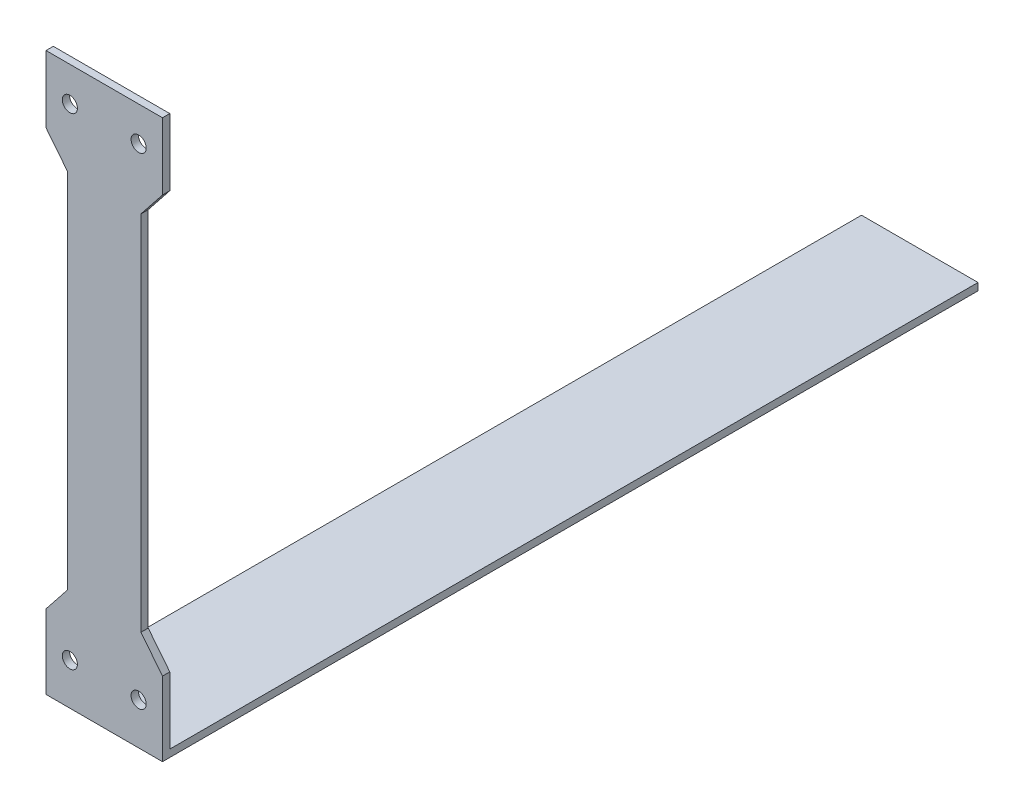
ISO-10303-21;
HEADER;
FILE_DESCRIPTION(('STEP AP214'),'2;1');
FILE_NAME('part.step','',(''),(''),'','','');
FILE_SCHEMA(('AUTOMOTIVE_DESIGN { 1 0 10303 214 1 1 1 1 }'));
ENDSEC;
DATA;
#1=APPLICATION_CONTEXT('core data for automotive mechanical design processes');
#2=APPLICATION_PROTOCOL_DEFINITION('international standard','automotive_design',2000,#1);
#3=PRODUCT_CONTEXT('',#1,'mechanical');
#4=PRODUCT('Part','Part','',(#3));
#5=PRODUCT_RELATED_PRODUCT_CATEGORY('part','',(#4));
#6=PRODUCT_DEFINITION_FORMATION('','',#4);
#7=PRODUCT_DEFINITION_CONTEXT('part definition',#1,'design');
#8=PRODUCT_DEFINITION('design','',#6,#7);
#9=PRODUCT_DEFINITION_SHAPE('','',#8);
#10=(LENGTH_UNIT() NAMED_UNIT(*) SI_UNIT(.MILLI.,.METRE.));
#11=(NAMED_UNIT(*) PLANE_ANGLE_UNIT() SI_UNIT($,.RADIAN.));
#12=(NAMED_UNIT(*) SI_UNIT($,.STERADIAN.) SOLID_ANGLE_UNIT());
#13=UNCERTAINTY_MEASURE_WITH_UNIT(LENGTH_MEASURE(1.E-05),#10,'distance_accuracy_value','');
#14=(GEOMETRIC_REPRESENTATION_CONTEXT(3) GLOBAL_UNCERTAINTY_ASSIGNED_CONTEXT((#13)) GLOBAL_UNIT_ASSIGNED_CONTEXT((#10,
#11,#12)) REPRESENTATION_CONTEXT('',''));
#15=CARTESIAN_POINT('',(0.,0.,0.));
#16=DIRECTION('',(0.,0.,1.));
#17=DIRECTION('',(1.,0.,0.));
#18=AXIS2_PLACEMENT_3D('',#15,#16,#17);
#19=CARTESIAN_POINT('',(-112.3,0.,1.5875));
#20=DIRECTION('',(1.,0.,0.));
#21=DIRECTION('',(0.,0.,-1.));
#22=AXIS2_PLACEMENT_3D('',#19,#20,#21);
#23=PLANE('',#22);
#24=DIRECTION('',(0.,-1.,0.));
#25=VECTOR('',#24,1.);
#26=CARTESIAN_POINT('',(-112.3,0.,0.));
#27=LINE('',#26,#25);
#28=CARTESIAN_POINT('',(-112.3,120.,0.));
#29=VERTEX_POINT('',#28);
#30=CARTESIAN_POINT('',(-112.3,105.418518518518,0.));
#31=VERTEX_POINT('',#30);
#32=EDGE_CURVE('E181',#29,#31,#27,.T.);
#33=ORIENTED_EDGE('',*,*,#32,.F.);
#34=DIRECTION('',(0.,0.,-1.));
#35=VECTOR('',#34,1.);
#36=CARTESIAN_POINT('',(-112.3,120.,1.5875));
#37=LINE('',#36,#35);
#38=CARTESIAN_POINT('',(-112.3,120.,1.5875));
#39=VERTEX_POINT('',#38);
#40=EDGE_CURVE('E11',#39,#29,#37,.T.);
#41=ORIENTED_EDGE('',*,*,#40,.F.);
#42=DIRECTION('',(0.,-1.,0.));
#43=VECTOR('',#42,1.);
#44=CARTESIAN_POINT('',(-112.3,0.,1.5875));
#45=LINE('',#44,#43);
#46=CARTESIAN_POINT('',(-112.3,105.418518518518,1.5875));
#47=VERTEX_POINT('',#46);
#48=EDGE_CURVE('E489',#39,#47,#45,.T.);
#49=ORIENTED_EDGE('',*,*,#48,.T.);
#50=DIRECTION('',(0.,0.,-1.));
#51=VECTOR('',#50,1.);
#52=CARTESIAN_POINT('',(-112.3,105.418518518518,1.5875));
#53=LINE('',#52,#51);
#54=EDGE_CURVE('E102',#47,#31,#53,.T.);
#55=ORIENTED_EDGE('',*,*,#54,.T.);
#56=EDGE_LOOP('',(#33,#41,#49,#55));
#57=FACE_BOUND('',#56,.T.);
#58=ADVANCED_FACE('F41',(#57),#23,.T.);
#59=CARTESIAN_POINT('',(0.,120.,1.5875));
#60=DIRECTION('',(0.,1.,0.));
#61=DIRECTION('',(0.,0.,1.));
#62=AXIS2_PLACEMENT_3D('',#59,#60,#61);
#63=PLANE('',#62);
#64=DIRECTION('',(1.,0.,0.));
#65=VECTOR('',#64,1.);
#66=CARTESIAN_POINT('',(0.,120.,0.));
#67=LINE('',#66,#65);
#68=CARTESIAN_POINT('',(-137.7,120.,0.));
#69=VERTEX_POINT('',#68);
#70=EDGE_CURVE('E179',#69,#29,#67,.T.);
#71=ORIENTED_EDGE('',*,*,#70,.F.);
#72=DIRECTION('',(0.,0.,-1.));
#73=VECTOR('',#72,1.);
#74=CARTESIAN_POINT('',(-137.7,120.,1.5875));
#75=LINE('',#74,#73);
#76=CARTESIAN_POINT('',(-137.7,120.,1.5875));
#77=VERTEX_POINT('',#76);
#78=EDGE_CURVE('E50',#77,#69,#75,.T.);
#79=ORIENTED_EDGE('',*,*,#78,.F.);
#80=DIRECTION('',(1.,0.,0.));
#81=VECTOR('',#80,1.);
#82=CARTESIAN_POINT('',(0.,120.,1.5875));
#83=LINE('',#82,#81);
#84=EDGE_CURVE('E491',#77,#39,#83,.T.);
#85=ORIENTED_EDGE('',*,*,#84,.T.);
#86=ORIENTED_EDGE('',*,*,#40,.T.);
#87=EDGE_LOOP('',(#71,#79,#85,#86));
#88=FACE_BOUND('',#87,.T.);
#89=ADVANCED_FACE('F180',(#88),#63,.T.);
#90=CARTESIAN_POINT('',(-137.7,0.,1.5875));
#91=DIRECTION('',(-1.,0.,0.));
#92=DIRECTION('',(0.,0.,1.));
#93=AXIS2_PLACEMENT_3D('',#90,#91,#92);
#94=PLANE('',#93);
#95=DIRECTION('',(0.,1.,0.));
#96=VECTOR('',#95,1.);
#97=CARTESIAN_POINT('',(-137.7,0.,0.));
#98=LINE('',#97,#96);
#99=CARTESIAN_POINT('',(-137.7,105.418518518518,0.));
#100=VERTEX_POINT('',#99);
#101=EDGE_CURVE('E172',#100,#69,#98,.T.);
#102=ORIENTED_EDGE('',*,*,#101,.F.);
#103=DIRECTION('',(0.,0.,-1.));
#104=VECTOR('',#103,1.);
#105=CARTESIAN_POINT('',(-137.7,105.418518518518,1.5875));
#106=LINE('',#105,#104);
#107=CARTESIAN_POINT('',(-137.7,105.418518518518,1.5875));
#108=VERTEX_POINT('',#107);
#109=EDGE_CURVE('E165',#108,#100,#106,.T.);
#110=ORIENTED_EDGE('',*,*,#109,.F.);
#111=DIRECTION('',(0.,1.,0.));
#112=VECTOR('',#111,1.);
#113=CARTESIAN_POINT('',(-137.7,0.,1.5875));
#114=LINE('',#113,#112);
#115=EDGE_CURVE('E174',#108,#77,#114,.T.);
#116=ORIENTED_EDGE('',*,*,#115,.T.);
#117=ORIENTED_EDGE('',*,*,#78,.T.);
#118=EDGE_LOOP('',(#102,#110,#116,#117));
#119=FACE_BOUND('',#118,.T.);
#120=ADVANCED_FACE('F170',(#119),#94,.T.);
#121=CARTESIAN_POINT('',(-33.1071618037136,-26.2909814323608,1.5875));
#122=DIRECTION('',(0.783110847498294,0.621882143601586,0.));
#123=DIRECTION('',(-0.621882143601586,0.783110847498294,0.));
#124=AXIS2_PLACEMENT_3D('',#121,#122,#123);
#125=PLANE('',#124);
#126=DIRECTION('',(0.621882143601586,-0.783110847498294,0.));
#127=VECTOR('',#126,1.);
#128=CARTESIAN_POINT('',(-33.1071618037136,-26.2909814323608,0.));
#129=LINE('',#128,#127);
#130=CARTESIAN_POINT('',(-133.,99.5,0.));
#131=VERTEX_POINT('',#130);
#132=EDGE_CURVE('E186',#100,#131,#129,.T.);
#133=ORIENTED_EDGE('',*,*,#132,.T.);
#134=DIRECTION('',(0.,0.,-1.));
#135=VECTOR('',#134,1.);
#136=CARTESIAN_POINT('',(-133.,99.5,1.5875));
#137=LINE('',#136,#135);
#138=CARTESIAN_POINT('',(-133.,99.5,1.5875));
#139=VERTEX_POINT('',#138);
#140=EDGE_CURVE('E162',#139,#131,#137,.T.);
#141=ORIENTED_EDGE('',*,*,#140,.F.);
#142=DIRECTION('',(0.621882143601586,-0.783110847498294,0.));
#143=VECTOR('',#142,1.);
#144=CARTESIAN_POINT('',(-33.1071618037136,-26.2909814323608,1.5875));
#145=LINE('',#144,#143);
#146=EDGE_CURVE('E494',#108,#139,#145,.T.);
#147=ORIENTED_EDGE('',*,*,#146,.F.);
#148=ORIENTED_EDGE('',*,*,#109,.T.);
#149=EDGE_LOOP('',(#133,#141,#147,#148));
#150=FACE_BOUND('',#149,.T.);
#151=ADVANCED_FACE('F296',(#150),#125,.F.);
#152=CARTESIAN_POINT('',(-133.,0.,1.5875));
#153=DIRECTION('',(1.,0.,0.));
#154=DIRECTION('',(0.,0.,-1.));
#155=AXIS2_PLACEMENT_3D('',#152,#153,#154);
#156=PLANE('',#155);
#157=DIRECTION('',(0.,-1.,0.));
#158=VECTOR('',#157,1.);
#159=CARTESIAN_POINT('',(-133.,0.,0.));
#160=LINE('',#159,#158);
#161=CARTESIAN_POINT('',(-133.,20.5,0.));
#162=VERTEX_POINT('',#161);
#163=EDGE_CURVE('E188',#131,#162,#160,.T.);
#164=ORIENTED_EDGE('',*,*,#163,.T.);
#165=DIRECTION('',(0.,0.,-1.));
#166=VECTOR('',#165,1.);
#167=CARTESIAN_POINT('',(-133.,20.5,1.5875));
#168=LINE('',#167,#166);
#169=CARTESIAN_POINT('',(-133.,20.5,1.5875));
#170=VERTEX_POINT('',#169);
#171=EDGE_CURVE('E159',#170,#162,#168,.T.);
#172=ORIENTED_EDGE('',*,*,#171,.F.);
#173=DIRECTION('',(0.,-1.,0.));
#174=VECTOR('',#173,1.);
#175=CARTESIAN_POINT('',(-133.,0.,1.5875));
#176=LINE('',#175,#174);
#177=EDGE_CURVE('E497',#139,#170,#176,.T.);
#178=ORIENTED_EDGE('',*,*,#177,.F.);
#179=ORIENTED_EDGE('',*,*,#140,.T.);
#180=EDGE_LOOP('',(#164,#172,#178,#179));
#181=FACE_BOUND('',#180,.T.);
#182=ADVANCED_FACE('F292',(#181),#156,.F.);
#183=CARTESIAN_POINT('',(-91.5474801061009,72.6994694960212,1.5875));
#184=DIRECTION('',(0.783110847498294,-0.621882143601586,0.));
#185=DIRECTION('',(0.621882143601586,0.783110847498294,0.));
#186=AXIS2_PLACEMENT_3D('',#183,#184,#185);
#187=PLANE('',#186);
#188=DIRECTION('',(-0.621882143601586,-0.783110847498294,0.));
#189=VECTOR('',#188,1.);
#190=CARTESIAN_POINT('',(-91.5474801061009,72.6994694960212,0.));
#191=LINE('',#190,#189);
#192=CARTESIAN_POINT('',(-137.7,14.5814814814815,0.));
#193=VERTEX_POINT('',#192);
#194=EDGE_CURVE('E194',#162,#193,#191,.T.);
#195=ORIENTED_EDGE('',*,*,#194,.T.);
#196=DIRECTION('',(0.,0.,-1.));
#197=VECTOR('',#196,1.);
#198=CARTESIAN_POINT('',(-137.7,14.5814814814815,1.5875));
#199=LINE('',#198,#197);
#200=CARTESIAN_POINT('',(-137.7,14.5814814814815,1.5875));
#201=VERTEX_POINT('',#200);
#202=EDGE_CURVE('E152',#201,#193,#199,.T.);
#203=ORIENTED_EDGE('',*,*,#202,.F.);
#204=DIRECTION('',(-0.621882143601586,-0.783110847498294,0.));
#205=VECTOR('',#204,1.);
#206=CARTESIAN_POINT('',(-91.5474801061009,72.6994694960212,1.5875));
#207=LINE('',#206,#205);
#208=EDGE_CURVE('E500',#170,#201,#207,.T.);
#209=ORIENTED_EDGE('',*,*,#208,.F.);
#210=ORIENTED_EDGE('',*,*,#171,.T.);
#211=EDGE_LOOP('',(#195,#203,#209,#210));
#212=FACE_BOUND('',#211,.T.);
#213=ADVANCED_FACE('F288',(#212),#187,.F.);
#214=CARTESIAN_POINT('',(-137.7,0.,1.5875));
#215=DIRECTION('',(1.,0.,0.));
#216=DIRECTION('',(0.,0.,-1.));
#217=AXIS2_PLACEMENT_3D('',#214,#215,#216);
#218=PLANE('',#217);
#219=DIRECTION('',(0.,-1.,0.));
#220=VECTOR('',#219,1.);
#221=CARTESIAN_POINT('',(-137.7,0.,0.));
#222=LINE('',#221,#220);
#223=CARTESIAN_POINT('',(-137.7,0.,0.));
#224=VERTEX_POINT('',#223);
#225=EDGE_CURVE('E197',#193,#224,#222,.T.);
#226=ORIENTED_EDGE('',*,*,#225,.T.);
#227=DIRECTION('',(0.,0.,1.));
#228=VECTOR('',#227,1.);
#229=CARTESIAN_POINT('',(-137.7,0.,-176.2125));
#230=LINE('',#229,#228);
#231=CARTESIAN_POINT('',(-137.7,0.,-176.2125));
#232=VERTEX_POINT('',#231);
#233=EDGE_CURVE('E456',#232,#224,#230,.T.);
#234=ORIENTED_EDGE('',*,*,#233,.F.);
#235=DIRECTION('',(0.,1.,0.));
#236=VECTOR('',#235,1.);
#237=CARTESIAN_POINT('',(-137.7,-1.5875,-176.2125));
#238=LINE('',#237,#236);
#239=CARTESIAN_POINT('',(-137.7,-1.5875,-176.2125));
#240=VERTEX_POINT('',#239);
#241=EDGE_CURVE('E216',#240,#232,#238,.T.);
#242=ORIENTED_EDGE('',*,*,#241,.F.);
#243=DIRECTION('',(0.,0.,1.));
#244=VECTOR('',#243,1.);
#245=CARTESIAN_POINT('',(-137.7,-1.5875,-176.2125));
#246=LINE('',#245,#244);
#247=CARTESIAN_POINT('',(-137.7,-1.5875,1.5875));
#248=VERTEX_POINT('',#247);
#249=EDGE_CURVE('E450',#240,#248,#246,.T.);
#250=ORIENTED_EDGE('',*,*,#249,.T.);
#251=DIRECTION('',(0.,-1.,0.));
#252=VECTOR('',#251,1.);
#253=CARTESIAN_POINT('',(-137.7,0.,1.5875));
#254=LINE('',#253,#252);
#255=EDGE_CURVE('E459',#201,#248,#254,.T.);
#256=ORIENTED_EDGE('',*,*,#255,.F.);
#257=ORIENTED_EDGE('',*,*,#202,.T.);
#258=EDGE_LOOP('',(#226,#234,#242,#250,#256,#257));
#259=FACE_BOUND('',#258,.T.);
#260=ADVANCED_FACE('F284',(#259),#218,.F.);
#261=CARTESIAN_POINT('',(-112.3,0.,1.5875));
#262=DIRECTION('',(1.,0.,0.));
#263=DIRECTION('',(0.,0.,-1.));
#264=AXIS2_PLACEMENT_3D('',#261,#262,#263);
#265=PLANE('',#264);
#266=DIRECTION('',(0.,-1.,0.));
#267=VECTOR('',#266,1.);
#268=CARTESIAN_POINT('',(-112.3,0.,0.));
#269=LINE('',#268,#267);
#270=CARTESIAN_POINT('',(-112.3,14.5814814814814,0.));
#271=VERTEX_POINT('',#270);
#272=CARTESIAN_POINT('',(-112.3,0.,0.));
#273=VERTEX_POINT('',#272);
#274=EDGE_CURVE('E203',#271,#273,#269,.T.);
#275=ORIENTED_EDGE('',*,*,#274,.F.);
#276=DIRECTION('',(0.,0.,-1.));
#277=VECTOR('',#276,1.);
#278=CARTESIAN_POINT('',(-112.3,14.5814814814814,1.5875));
#279=LINE('',#278,#277);
#280=CARTESIAN_POINT('',(-112.3,14.5814814814814,1.5875));
#281=VERTEX_POINT('',#280);
#282=EDGE_CURVE('E150',#281,#271,#279,.T.);
#283=ORIENTED_EDGE('',*,*,#282,.F.);
#284=DIRECTION('',(0.,-1.,0.));
#285=VECTOR('',#284,1.);
#286=CARTESIAN_POINT('',(-112.3,0.,1.5875));
#287=LINE('',#286,#285);
#288=CARTESIAN_POINT('',(-112.3,-1.5875,1.5875));
#289=VERTEX_POINT('',#288);
#290=EDGE_CURVE('E144',#281,#289,#287,.T.);
#291=ORIENTED_EDGE('',*,*,#290,.T.);
#292=DIRECTION('',(0.,0.,-1.));
#293=VECTOR('',#292,1.);
#294=CARTESIAN_POINT('',(-112.3,-1.5875,1.5875));
#295=LINE('',#294,#293);
#296=CARTESIAN_POINT('',(-112.3,-1.5875,-176.2125));
#297=VERTEX_POINT('',#296);
#298=EDGE_CURVE('E453',#289,#297,#295,.T.);
#299=ORIENTED_EDGE('',*,*,#298,.T.);
#300=DIRECTION('',(0.,1.,0.));
#301=VECTOR('',#300,1.);
#302=CARTESIAN_POINT('',(-112.3,-1.5875,-176.2125));
#303=LINE('',#302,#301);
#304=CARTESIAN_POINT('',(-112.3,0.,-176.2125));
#305=VERTEX_POINT('',#304);
#306=EDGE_CURVE('E464',#297,#305,#303,.T.);
#307=ORIENTED_EDGE('',*,*,#306,.T.);
#308=DIRECTION('',(0.,0.,-1.));
#309=VECTOR('',#308,1.);
#310=CARTESIAN_POINT('',(-112.3,0.,1.5875));
#311=LINE('',#310,#309);
#312=EDGE_CURVE('E472',#273,#305,#311,.T.);
#313=ORIENTED_EDGE('',*,*,#312,.F.);
#314=EDGE_LOOP('',(#275,#283,#291,#299,#307,#313));
#315=FACE_BOUND('',#314,.T.);
#316=ADVANCED_FACE('F281',(#315),#265,.T.);
#317=CARTESIAN_POINT('',(-61.7681697612732,-49.0511936339523,1.5875));
#318=DIRECTION('',(-0.783110847498294,-0.621882143601587,0.));
#319=DIRECTION('',(0.621882143601587,-0.783110847498294,0.));
#320=AXIS2_PLACEMENT_3D('',#317,#318,#319);
#321=PLANE('',#320);
#322=DIRECTION('',(-0.621882143601587,0.783110847498294,0.));
#323=VECTOR('',#322,1.);
#324=CARTESIAN_POINT('',(-61.7681697612732,-49.0511936339523,0.));
#325=LINE('',#324,#323);
#326=CARTESIAN_POINT('',(-117.,20.5,0.));
#327=VERTEX_POINT('',#326);
#328=EDGE_CURVE('E149',#271,#327,#325,.T.);
#329=ORIENTED_EDGE('',*,*,#328,.T.);
#330=DIRECTION('',(0.,0.,-1.));
#331=VECTOR('',#330,1.);
#332=CARTESIAN_POINT('',(-117.,20.5,1.5875));
#333=LINE('',#332,#331);
#334=CARTESIAN_POINT('',(-117.,20.5,1.5875));
#335=VERTEX_POINT('',#334);
#336=EDGE_CURVE('E134',#335,#327,#333,.T.);
#337=ORIENTED_EDGE('',*,*,#336,.F.);
#338=DIRECTION('',(-0.621882143601587,0.783110847498294,0.));
#339=VECTOR('',#338,1.);
#340=CARTESIAN_POINT('',(-61.7681697612732,-49.0511936339523,1.5875));
#341=LINE('',#340,#339);
#342=EDGE_CURVE('E137',#281,#335,#341,.T.);
#343=ORIENTED_EDGE('',*,*,#342,.F.);
#344=ORIENTED_EDGE('',*,*,#282,.T.);
#345=EDGE_LOOP('',(#329,#337,#343,#344));
#346=FACE_BOUND('',#345,.T.);
#347=ADVANCED_FACE('F147',(#346),#321,.F.);
#348=CARTESIAN_POINT('',(-117.,0.,1.5875));
#349=DIRECTION('',(-1.,0.,0.));
#350=DIRECTION('',(0.,0.,1.));
#351=AXIS2_PLACEMENT_3D('',#348,#349,#350);
#352=PLANE('',#351);
#353=DIRECTION('',(0.,1.,0.));
#354=VECTOR('',#353,1.);
#355=CARTESIAN_POINT('',(-117.,0.,0.));
#356=LINE('',#355,#354);
#357=CARTESIAN_POINT('',(-117.,99.5,0.));
#358=VERTEX_POINT('',#357);
#359=EDGE_CURVE('E207',#327,#358,#356,.T.);
#360=ORIENTED_EDGE('',*,*,#359,.T.);
#361=DIRECTION('',(0.,0.,-1.));
#362=VECTOR('',#361,1.);
#363=CARTESIAN_POINT('',(-117.,99.5,1.5875));
#364=LINE('',#363,#362);
#365=CARTESIAN_POINT('',(-117.,99.5,1.5875));
#366=VERTEX_POINT('',#365);
#367=EDGE_CURVE('E136',#366,#358,#364,.T.);
#368=ORIENTED_EDGE('',*,*,#367,.F.);
#369=DIRECTION('',(0.,1.,0.));
#370=VECTOR('',#369,1.);
#371=CARTESIAN_POINT('',(-117.,0.,1.5875));
#372=LINE('',#371,#370);
#373=EDGE_CURVE('E129',#335,#366,#372,.T.);
#374=ORIENTED_EDGE('',*,*,#373,.F.);
#375=ORIENTED_EDGE('',*,*,#336,.T.);
#376=EDGE_LOOP('',(#360,#368,#374,#375));
#377=FACE_BOUND('',#376,.T.);
#378=ADVANCED_FACE('F132',(#377),#352,.F.);
#379=CARTESIAN_POINT('',(-132.5,112.5,1.5875));
#380=DIRECTION('',(0.,0.,-1.));
#381=DIRECTION('',(-1.,0.,0.));
#382=AXIS2_PLACEMENT_3D('',#379,#380,#381);
#383=CYLINDRICAL_SURFACE('',#382,1.65);
#384=CARTESIAN_POINT('',(-132.5,112.5,1.5875));
#385=DIRECTION('',(0.,0.,1.));
#386=DIRECTION('',(1.,0.,0.));
#387=AXIS2_PLACEMENT_3D('',#384,#385,#386);
#388=CIRCLE('',#387,1.65);
#389=CARTESIAN_POINT('',(-130.85,112.5,1.5875));
#390=VERTEX_POINT('',#389);
#391=EDGE_CURVE('E486',#390,#390,#388,.T.);
#392=ORIENTED_EDGE('',*,*,#391,.T.);
#393=EDGE_LOOP('',(#392));
#394=FACE_BOUND('',#393,.T.);
#395=CARTESIAN_POINT('',(-132.5,112.5,0.));
#396=DIRECTION('',(0.,0.,1.));
#397=DIRECTION('',(1.,0.,0.));
#398=AXIS2_PLACEMENT_3D('',#395,#396,#397);
#399=CIRCLE('',#398,1.65);
#400=CARTESIAN_POINT('',(-130.85,112.5,0.));
#401=VERTEX_POINT('',#400);
#402=EDGE_CURVE('E222',#401,#401,#399,.T.);
#403=ORIENTED_EDGE('',*,*,#402,.F.);
#404=EDGE_LOOP('',(#403));
#405=FACE_BOUND('',#404,.T.);
#406=ADVANCED_FACE('F232',(#394,#405),#383,.F.);
#407=CARTESIAN_POINT('',(-117.5,112.5,1.5875));
#408=DIRECTION('',(0.,0.,-1.));
#409=DIRECTION('',(-1.,0.,0.));
#410=AXIS2_PLACEMENT_3D('',#407,#408,#409);
#411=CYLINDRICAL_SURFACE('',#410,1.65000000000001);
#412=CARTESIAN_POINT('',(-117.5,112.5,1.5875));
#413=DIRECTION('',(0.,0.,1.));
#414=DIRECTION('',(1.,0.,0.));
#415=AXIS2_PLACEMENT_3D('',#412,#413,#414);
#416=CIRCLE('',#415,1.65000000000001);
#417=CARTESIAN_POINT('',(-115.85,112.5,1.5875));
#418=VERTEX_POINT('',#417);
#419=EDGE_CURVE('E483',#418,#418,#416,.T.);
#420=ORIENTED_EDGE('',*,*,#419,.T.);
#421=EDGE_LOOP('',(#420));
#422=FACE_BOUND('',#421,.T.);
#423=CARTESIAN_POINT('',(-117.5,112.5,0.));
#424=DIRECTION('',(0.,0.,1.));
#425=DIRECTION('',(1.,0.,0.));
#426=AXIS2_PLACEMENT_3D('',#423,#424,#425);
#427=CIRCLE('',#426,1.65000000000001);
#428=CARTESIAN_POINT('',(-115.85,112.5,0.));
#429=VERTEX_POINT('',#428);
#430=EDGE_CURVE('E219',#429,#429,#427,.T.);
#431=ORIENTED_EDGE('',*,*,#430,.F.);
#432=EDGE_LOOP('',(#431));
#433=FACE_BOUND('',#432,.T.);
#434=ADVANCED_FACE('F235',(#422,#433),#411,.F.);
#435=CARTESIAN_POINT('',(-117.5,7.5,1.5875));
#436=DIRECTION('',(0.,0.,-1.));
#437=DIRECTION('',(-1.,0.,0.));
#438=AXIS2_PLACEMENT_3D('',#435,#436,#437);
#439=CYLINDRICAL_SURFACE('',#438,1.65000000000001);
#440=CARTESIAN_POINT('',(-117.5,7.5,1.5875));
#441=DIRECTION('',(0.,0.,1.));
#442=DIRECTION('',(1.,0.,0.));
#443=AXIS2_PLACEMENT_3D('',#440,#441,#442);
#444=CIRCLE('',#443,1.65000000000001);
#445=CARTESIAN_POINT('',(-115.85,7.5,1.5875));
#446=VERTEX_POINT('',#445);
#447=EDGE_CURVE('E250',#446,#446,#444,.T.);
#448=ORIENTED_EDGE('',*,*,#447,.T.);
#449=EDGE_LOOP('',(#448));
#450=FACE_BOUND('',#449,.T.);
#451=CARTESIAN_POINT('',(-117.5,7.5,0.));
#452=DIRECTION('',(0.,0.,1.));
#453=DIRECTION('',(1.,0.,0.));
#454=AXIS2_PLACEMENT_3D('',#451,#452,#453);
#455=CIRCLE('',#454,1.65000000000001);
#456=CARTESIAN_POINT('',(-115.85,7.5,0.));
#457=VERTEX_POINT('',#456);
#458=EDGE_CURVE('E215',#457,#457,#455,.T.);
#459=ORIENTED_EDGE('',*,*,#458,.F.);
#460=EDGE_LOOP('',(#459));
#461=FACE_BOUND('',#460,.T.);
#462=ADVANCED_FACE('F238',(#450,#461),#439,.F.);
#463=CARTESIAN_POINT('',(-132.5,7.5,1.5875));
#464=DIRECTION('',(0.,0.,-1.));
#465=DIRECTION('',(-1.,0.,0.));
#466=AXIS2_PLACEMENT_3D('',#463,#464,#465);
#467=CYLINDRICAL_SURFACE('',#466,1.65);
#468=CARTESIAN_POINT('',(-132.5,7.5,1.5875));
#469=DIRECTION('',(0.,0.,1.));
#470=DIRECTION('',(1.,0.,0.));
#471=AXIS2_PLACEMENT_3D('',#468,#469,#470);
#472=CIRCLE('',#471,1.65);
#473=CARTESIAN_POINT('',(-130.85,7.5,1.5875));
#474=VERTEX_POINT('',#473);
#475=EDGE_CURVE('E209',#474,#474,#472,.T.);
#476=ORIENTED_EDGE('',*,*,#475,.T.);
#477=EDGE_LOOP('',(#476));
#478=FACE_BOUND('',#477,.T.);
#479=CARTESIAN_POINT('',(-132.5,7.5,0.));
#480=DIRECTION('',(0.,0.,1.));
#481=DIRECTION('',(1.,0.,0.));
#482=AXIS2_PLACEMENT_3D('',#479,#480,#481);
#483=CIRCLE('',#482,1.65);
#484=CARTESIAN_POINT('',(-130.85,7.5,0.));
#485=VERTEX_POINT('',#484);
#486=EDGE_CURVE('E212',#485,#485,#483,.T.);
#487=ORIENTED_EDGE('',*,*,#486,.F.);
#488=EDGE_LOOP('',(#487));
#489=FACE_BOUND('',#488,.T.);
#490=ADVANCED_FACE('F43',(#478,#489),#467,.F.);
#491=CARTESIAN_POINT('',(-120.20848806366,95.4596816976128,1.5875));
#492=DIRECTION('',(-0.783110847498294,0.621882143601587,0.));
#493=DIRECTION('',(-0.621882143601587,-0.783110847498294,0.));
#494=AXIS2_PLACEMENT_3D('',#491,#492,#493);
#495=PLANE('',#494);
#496=DIRECTION('',(0.621882143601587,0.783110847498294,0.));
#497=VECTOR('',#496,1.);
#498=CARTESIAN_POINT('',(-120.20848806366,95.4596816976128,0.));
#499=LINE('',#498,#497);
#500=EDGE_CURVE('E95',#358,#31,#499,.T.);
#501=ORIENTED_EDGE('',*,*,#500,.T.);
#502=ORIENTED_EDGE('',*,*,#54,.F.);
#503=DIRECTION('',(0.621882143601587,0.783110847498294,0.));
#504=VECTOR('',#503,1.);
#505=CARTESIAN_POINT('',(-120.20848806366,95.4596816976128,1.5875));
#506=LINE('',#505,#504);
#507=EDGE_CURVE('E58',#366,#47,#506,.T.);
#508=ORIENTED_EDGE('',*,*,#507,.F.);
#509=ORIENTED_EDGE('',*,*,#367,.T.);
#510=EDGE_LOOP('',(#501,#502,#508,#509));
#511=FACE_BOUND('',#510,.T.);
#512=ADVANCED_FACE('F245',(#511),#495,.F.);
#513=CARTESIAN_POINT('',(0.,0.,1.5875));
#514=DIRECTION('',(0.,0.,1.));
#515=DIRECTION('',(1.,0.,0.));
#516=AXIS2_PLACEMENT_3D('',#513,#514,#515);
#517=PLANE('',#516);
#518=ORIENTED_EDGE('',*,*,#475,.F.);
#519=EDGE_LOOP('',(#518));
#520=FACE_BOUND('',#519,.T.);
#521=ORIENTED_EDGE('',*,*,#447,.F.);
#522=EDGE_LOOP('',(#521));
#523=FACE_BOUND('',#522,.T.);
#524=ORIENTED_EDGE('',*,*,#419,.F.);
#525=EDGE_LOOP('',(#524));
#526=FACE_BOUND('',#525,.T.);
#527=ORIENTED_EDGE('',*,*,#391,.F.);
#528=EDGE_LOOP('',(#527));
#529=FACE_BOUND('',#528,.T.);
#530=ORIENTED_EDGE('',*,*,#48,.F.);
#531=ORIENTED_EDGE('',*,*,#84,.F.);
#532=ORIENTED_EDGE('',*,*,#115,.F.);
#533=ORIENTED_EDGE('',*,*,#146,.T.);
#534=ORIENTED_EDGE('',*,*,#177,.T.);
#535=ORIENTED_EDGE('',*,*,#208,.T.);
#536=ORIENTED_EDGE('',*,*,#255,.T.);
#537=DIRECTION('',(1.,0.,0.));
#538=VECTOR('',#537,1.);
#539=CARTESIAN_POINT('',(-137.7,-1.5875,1.5875));
#540=LINE('',#539,#538);
#541=EDGE_CURVE('E446',#248,#289,#540,.T.);
#542=ORIENTED_EDGE('',*,*,#541,.T.);
#543=ORIENTED_EDGE('',*,*,#290,.F.);
#544=ORIENTED_EDGE('',*,*,#342,.T.);
#545=ORIENTED_EDGE('',*,*,#373,.T.);
#546=ORIENTED_EDGE('',*,*,#507,.T.);
#547=EDGE_LOOP('',(#530,#531,#532,#533,#534,#535,#536,#542,#543,#544,#545,#546));
#548=FACE_BOUND('',#547,.T.);
#549=ADVANCED_FACE('F141',(#520,#523,#526,#529,#548),#517,.T.);
#550=CARTESIAN_POINT('',(0.,0.,0.));
#551=DIRECTION('',(0.,0.,1.));
#552=DIRECTION('',(1.,0.,0.));
#553=AXIS2_PLACEMENT_3D('',#550,#551,#552);
#554=PLANE('',#553);
#555=ORIENTED_EDGE('',*,*,#486,.T.);
#556=EDGE_LOOP('',(#555));
#557=FACE_BOUND('',#556,.T.);
#558=ORIENTED_EDGE('',*,*,#458,.T.);
#559=EDGE_LOOP('',(#558));
#560=FACE_BOUND('',#559,.T.);
#561=ORIENTED_EDGE('',*,*,#430,.T.);
#562=EDGE_LOOP('',(#561));
#563=FACE_BOUND('',#562,.T.);
#564=ORIENTED_EDGE('',*,*,#402,.T.);
#565=EDGE_LOOP('',(#564));
#566=FACE_BOUND('',#565,.T.);
#567=ORIENTED_EDGE('',*,*,#32,.T.);
#568=ORIENTED_EDGE('',*,*,#500,.F.);
#569=ORIENTED_EDGE('',*,*,#359,.F.);
#570=ORIENTED_EDGE('',*,*,#328,.F.);
#571=ORIENTED_EDGE('',*,*,#274,.T.);
#572=DIRECTION('',(-1.,0.,0.));
#573=VECTOR('',#572,1.);
#574=CARTESIAN_POINT('',(0.,0.,0.));
#575=LINE('',#574,#573);
#576=EDGE_CURVE('E200',#273,#224,#575,.T.);
#577=ORIENTED_EDGE('',*,*,#576,.T.);
#578=ORIENTED_EDGE('',*,*,#225,.F.);
#579=ORIENTED_EDGE('',*,*,#194,.F.);
#580=ORIENTED_EDGE('',*,*,#163,.F.);
#581=ORIENTED_EDGE('',*,*,#132,.F.);
#582=ORIENTED_EDGE('',*,*,#101,.T.);
#583=ORIENTED_EDGE('',*,*,#70,.T.);
#584=EDGE_LOOP('',(#567,#568,#569,#570,#571,#577,#578,#579,#580,#581,#582,#583));
#585=FACE_BOUND('',#584,.T.);
#586=ADVANCED_FACE('F184',(#557,#560,#563,#566,#585),#554,.F.);
#587=CARTESIAN_POINT('',(0.,0.,0.));
#588=DIRECTION('',(0.,1.,0.));
#589=DIRECTION('',(0.,0.,1.));
#590=AXIS2_PLACEMENT_3D('',#587,#588,#589);
#591=PLANE('',#590);
#592=ORIENTED_EDGE('',*,*,#576,.F.);
#593=ORIENTED_EDGE('',*,*,#312,.T.);
#594=DIRECTION('',(-1.,0.,0.));
#595=VECTOR('',#594,1.);
#596=CARTESIAN_POINT('',(-112.3,0.,-176.2125));
#597=LINE('',#596,#595);
#598=EDGE_CURVE('E475',#305,#232,#597,.T.);
#599=ORIENTED_EDGE('',*,*,#598,.T.);
#600=ORIENTED_EDGE('',*,*,#233,.T.);
#601=EDGE_LOOP('',(#592,#593,#599,#600));
#602=FACE_BOUND('',#601,.T.);
#603=ADVANCED_FACE('F255',(#602),#591,.T.);
#604=CARTESIAN_POINT('',(-112.3,-1.5875,-176.2125));
#605=DIRECTION('',(0.,0.,-1.));
#606=DIRECTION('',(-1.,0.,0.));
#607=AXIS2_PLACEMENT_3D('',#604,#605,#606);
#608=PLANE('',#607);
#609=ORIENTED_EDGE('',*,*,#598,.F.);
#610=ORIENTED_EDGE('',*,*,#306,.F.);
#611=DIRECTION('',(-1.,0.,0.));
#612=VECTOR('',#611,1.);
#613=CARTESIAN_POINT('',(-112.3,-1.5875,-176.2125));
#614=LINE('',#613,#612);
#615=EDGE_CURVE('E465',#297,#240,#614,.T.);
#616=ORIENTED_EDGE('',*,*,#615,.T.);
#617=ORIENTED_EDGE('',*,*,#241,.T.);
#618=EDGE_LOOP('',(#609,#610,#616,#617));
#619=FACE_BOUND('',#618,.T.);
#620=ADVANCED_FACE('F267',(#619),#608,.T.);
#621=CARTESIAN_POINT('',(0.,-1.5875,0.));
#622=DIRECTION('',(0.,1.,0.));
#623=DIRECTION('',(0.,0.,1.));
#624=AXIS2_PLACEMENT_3D('',#621,#622,#623);
#625=PLANE('',#624);
#626=ORIENTED_EDGE('',*,*,#541,.F.);
#627=ORIENTED_EDGE('',*,*,#249,.F.);
#628=ORIENTED_EDGE('',*,*,#615,.F.);
#629=ORIENTED_EDGE('',*,*,#298,.F.);
#630=EDGE_LOOP('',(#626,#627,#628,#629));
#631=FACE_BOUND('',#630,.T.);
#632=ADVANCED_FACE('F428',(#631),#625,.F.);
#633=CLOSED_SHELL('',(#58,#89,#120,#151,#182,#213,#260,#316,#347,#378,#406,#434,#462,#490,#512,
#549,#586,#603,#620,#632));
#634=MANIFOLD_SOLID_BREP('B2',#633);
#635=ADVANCED_BREP_SHAPE_REPRESENTATION('',(#18,#634),#14);
#636=SHAPE_DEFINITION_REPRESENTATION(#9,#635);
ENDSEC;
END-ISO-10303-21;
